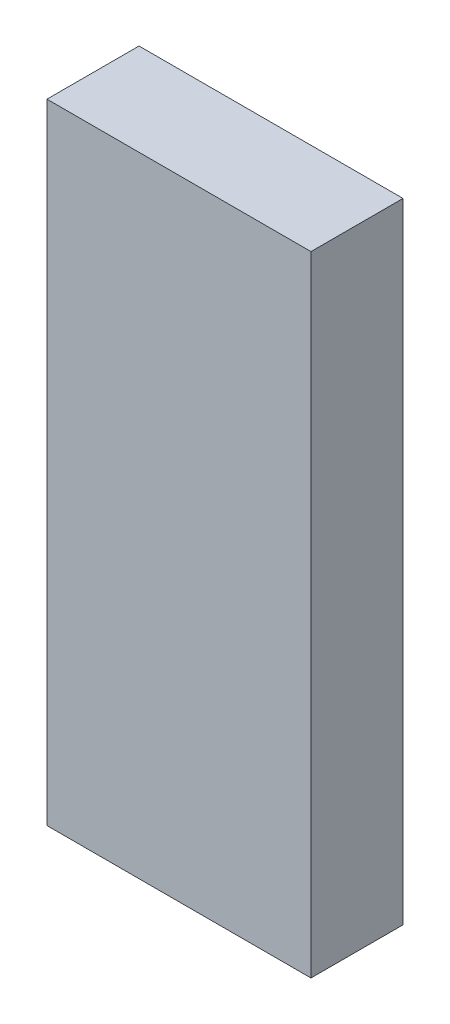
ISO-10303-21;
HEADER;
FILE_DESCRIPTION(('STEP AP214'),'2;1');
FILE_NAME('part.step','',(''),(''),'','','');
FILE_SCHEMA(('AUTOMOTIVE_DESIGN { 1 0 10303 214 1 1 1 1 }'));
ENDSEC;
DATA;
#1=APPLICATION_CONTEXT('core data for automotive mechanical design processes');
#2=APPLICATION_PROTOCOL_DEFINITION('international standard','automotive_design',2000,#1);
#3=PRODUCT_CONTEXT('',#1,'mechanical');
#4=PRODUCT('Part','Part','',(#3));
#5=PRODUCT_RELATED_PRODUCT_CATEGORY('part','',(#4));
#6=PRODUCT_DEFINITION_FORMATION('','',#4);
#7=PRODUCT_DEFINITION_CONTEXT('part definition',#1,'design');
#8=PRODUCT_DEFINITION('design','',#6,#7);
#9=PRODUCT_DEFINITION_SHAPE('','',#8);
#10=(LENGTH_UNIT() NAMED_UNIT(*) SI_UNIT(.MILLI.,.METRE.));
#11=(NAMED_UNIT(*) PLANE_ANGLE_UNIT() SI_UNIT($,.RADIAN.));
#12=(NAMED_UNIT(*) SI_UNIT($,.STERADIAN.) SOLID_ANGLE_UNIT());
#13=UNCERTAINTY_MEASURE_WITH_UNIT(LENGTH_MEASURE(1.E-05),#10,'distance_accuracy_value','');
#14=(GEOMETRIC_REPRESENTATION_CONTEXT(3) GLOBAL_UNCERTAINTY_ASSIGNED_CONTEXT((#13)) GLOBAL_UNIT_ASSIGNED_CONTEXT((#10,
#11,#12)) REPRESENTATION_CONTEXT('',''));
#15=CARTESIAN_POINT('',(0.,0.,0.));
#16=DIRECTION('',(0.,0.,1.));
#17=DIRECTION('',(1.,0.,0.));
#18=AXIS2_PLACEMENT_3D('',#15,#16,#17);
#19=CARTESIAN_POINT('',(3.80000002,9.05500094,2.65));
#20=DIRECTION('',(0.,0.,-1.));
#21=DIRECTION('',(-1.,0.,0.));
#22=AXIS2_PLACEMENT_3D('',#19,#20,#21);
#23=PLANE('',#22);
#24=DIRECTION('',(0.,1.,0.));
#25=VECTOR('',#24,1.);
#26=CARTESIAN_POINT('',(-3.80000002,9.05500094,2.65));
#27=LINE('',#26,#25);
#28=CARTESIAN_POINT('',(-3.80000002,9.05500094,2.65));
#29=VERTEX_POINT('',#28);
#30=CARTESIAN_POINT('',(-3.80000002,-9.05500094,2.65));
#31=VERTEX_POINT('',#30);
#32=EDGE_CURVE('E55',#29,#31,#27,.F.);
#33=ORIENTED_EDGE('',*,*,#32,.T.);
#34=DIRECTION('',(1.,0.,0.));
#35=VECTOR('',#34,1.);
#36=CARTESIAN_POINT('',(-3.80000002,-9.05500094,2.65));
#37=LINE('',#36,#35);
#38=CARTESIAN_POINT('',(3.80000002,-9.05500094,2.65));
#39=VERTEX_POINT('',#38);
#40=EDGE_CURVE('E57',#31,#39,#37,.T.);
#41=ORIENTED_EDGE('',*,*,#40,.T.);
#42=DIRECTION('',(0.,1.,0.));
#43=VECTOR('',#42,1.);
#44=CARTESIAN_POINT('',(3.80000002,-9.05500094,2.65));
#45=LINE('',#44,#43);
#46=CARTESIAN_POINT('',(3.80000002,9.05500094,2.65));
#47=VERTEX_POINT('',#46);
#48=EDGE_CURVE('E20',#39,#47,#45,.T.);
#49=ORIENTED_EDGE('',*,*,#48,.T.);
#50=DIRECTION('',(1.,0.,0.));
#51=VECTOR('',#50,1.);
#52=CARTESIAN_POINT('',(3.80000002,9.05500094,2.65));
#53=LINE('',#52,#51);
#54=EDGE_CURVE('E80',#47,#29,#53,.F.);
#55=ORIENTED_EDGE('',*,*,#54,.T.);
#56=EDGE_LOOP('',(#33,#41,#49,#55));
#57=FACE_BOUND('',#56,.T.);
#58=ADVANCED_FACE('F17',(#57),#23,.F.);
#59=CARTESIAN_POINT('',(3.80000002,-9.05500094,0.));
#60=DIRECTION('',(-1.,0.,0.));
#61=DIRECTION('',(0.,0.,1.));
#62=AXIS2_PLACEMENT_3D('',#59,#60,#61);
#63=PLANE('',#62);
#64=DIRECTION('',(0.,0.,-1.));
#65=VECTOR('',#64,1.);
#66=CARTESIAN_POINT('',(3.80000002,9.05500094,0.));
#67=LINE('',#66,#65);
#68=CARTESIAN_POINT('',(3.80000002,9.05500094,0.));
#69=VERTEX_POINT('',#68);
#70=EDGE_CURVE('E68',#69,#47,#67,.F.);
#71=ORIENTED_EDGE('',*,*,#70,.T.);
#72=ORIENTED_EDGE('',*,*,#48,.F.);
#73=DIRECTION('',(0.,0.,1.));
#74=VECTOR('',#73,1.);
#75=CARTESIAN_POINT('',(3.80000002,-9.05500094,0.));
#76=LINE('',#75,#74);
#77=CARTESIAN_POINT('',(3.80000002,-9.05500094,0.));
#78=VERTEX_POINT('',#77);
#79=EDGE_CURVE('E63',#39,#78,#76,.F.);
#80=ORIENTED_EDGE('',*,*,#79,.T.);
#81=DIRECTION('',(0.,1.,0.));
#82=VECTOR('',#81,1.);
#83=CARTESIAN_POINT('',(3.80000002,9.05500094,0.));
#84=LINE('',#83,#82);
#85=EDGE_CURVE('E83',#69,#78,#84,.F.);
#86=ORIENTED_EDGE('',*,*,#85,.F.);
#87=EDGE_LOOP('',(#71,#72,#80,#86));
#88=FACE_BOUND('',#87,.T.);
#89=ADVANCED_FACE('F65',(#88),#63,.F.);
#90=CARTESIAN_POINT('',(-3.80000002,-9.05500094,0.));
#91=DIRECTION('',(0.,1.,0.));
#92=DIRECTION('',(0.,0.,1.));
#93=AXIS2_PLACEMENT_3D('',#90,#91,#92);
#94=PLANE('',#93);
#95=ORIENTED_EDGE('',*,*,#79,.F.);
#96=ORIENTED_EDGE('',*,*,#40,.F.);
#97=DIRECTION('',(0.,0.,-1.));
#98=VECTOR('',#97,1.);
#99=CARTESIAN_POINT('',(-3.80000002,-9.05500094,0.));
#100=LINE('',#99,#98);
#101=CARTESIAN_POINT('',(-3.80000002,-9.05500094,0.));
#102=VERTEX_POINT('',#101);
#103=EDGE_CURVE('E75',#31,#102,#100,.T.);
#104=ORIENTED_EDGE('',*,*,#103,.T.);
#105=DIRECTION('',(-1.,0.,0.));
#106=VECTOR('',#105,1.);
#107=CARTESIAN_POINT('',(3.80000002,-9.05500094,0.));
#108=LINE('',#107,#106);
#109=EDGE_CURVE('E72',#78,#102,#108,.T.);
#110=ORIENTED_EDGE('',*,*,#109,.F.);
#111=EDGE_LOOP('',(#95,#96,#104,#110));
#112=FACE_BOUND('',#111,.T.);
#113=ADVANCED_FACE('F70',(#112),#94,.F.);
#114=CARTESIAN_POINT('',(-3.80000002,9.05500094,0.));
#115=DIRECTION('',(1.,0.,0.));
#116=DIRECTION('',(0.,0.,-1.));
#117=AXIS2_PLACEMENT_3D('',#114,#115,#116);
#118=PLANE('',#117);
#119=ORIENTED_EDGE('',*,*,#103,.F.);
#120=ORIENTED_EDGE('',*,*,#32,.F.);
#121=DIRECTION('',(0.,0.,-1.));
#122=VECTOR('',#121,1.);
#123=CARTESIAN_POINT('',(-3.80000002,9.05500094,0.));
#124=LINE('',#123,#122);
#125=CARTESIAN_POINT('',(-3.80000002,9.05500094,0.));
#126=VERTEX_POINT('',#125);
#127=EDGE_CURVE('E35',#29,#126,#124,.T.);
#128=ORIENTED_EDGE('',*,*,#127,.T.);
#129=DIRECTION('',(0.,1.,0.));
#130=VECTOR('',#129,1.);
#131=CARTESIAN_POINT('',(-3.80000002,9.05500094,0.));
#132=LINE('',#131,#130);
#133=EDGE_CURVE('E26',#102,#126,#132,.T.);
#134=ORIENTED_EDGE('',*,*,#133,.F.);
#135=EDGE_LOOP('',(#119,#120,#128,#134));
#136=FACE_BOUND('',#135,.T.);
#137=ADVANCED_FACE('F89',(#136),#118,.F.);
#138=CARTESIAN_POINT('',(3.80000002,9.05500094,0.));
#139=DIRECTION('',(0.,-1.,0.));
#140=DIRECTION('',(0.,0.,-1.));
#141=AXIS2_PLACEMENT_3D('',#138,#139,#140);
#142=PLANE('',#141);
#143=ORIENTED_EDGE('',*,*,#127,.F.);
#144=ORIENTED_EDGE('',*,*,#54,.F.);
#145=ORIENTED_EDGE('',*,*,#70,.F.);
#146=DIRECTION('',(-1.,0.,0.));
#147=VECTOR('',#146,1.);
#148=CARTESIAN_POINT('',(3.80000002,9.05500094,0.));
#149=LINE('',#148,#147);
#150=EDGE_CURVE('E11',#126,#69,#149,.F.);
#151=ORIENTED_EDGE('',*,*,#150,.F.);
#152=EDGE_LOOP('',(#143,#144,#145,#151));
#153=FACE_BOUND('',#152,.T.);
#154=ADVANCED_FACE('F91',(#153),#142,.F.);
#155=CARTESIAN_POINT('',(3.80000002,9.05500094,0.));
#156=DIRECTION('',(0.,0.,-1.));
#157=DIRECTION('',(-1.,0.,0.));
#158=AXIS2_PLACEMENT_3D('',#155,#156,#157);
#159=PLANE('',#158);
#160=ORIENTED_EDGE('',*,*,#133,.T.);
#161=ORIENTED_EDGE('',*,*,#150,.T.);
#162=ORIENTED_EDGE('',*,*,#85,.T.);
#163=ORIENTED_EDGE('',*,*,#109,.T.);
#164=EDGE_LOOP('',(#160,#161,#162,#163));
#165=FACE_BOUND('',#164,.T.);
#166=ADVANCED_FACE('F88',(#165),#159,.T.);
#167=CLOSED_SHELL('',(#58,#89,#113,#137,#154,#166));
#168=MANIFOLD_SOLID_BREP('B1',#167);
#169=ADVANCED_BREP_SHAPE_REPRESENTATION('',(#18,#168),#14);
#170=SHAPE_DEFINITION_REPRESENTATION(#9,#169);
ENDSEC;
END-ISO-10303-21;
